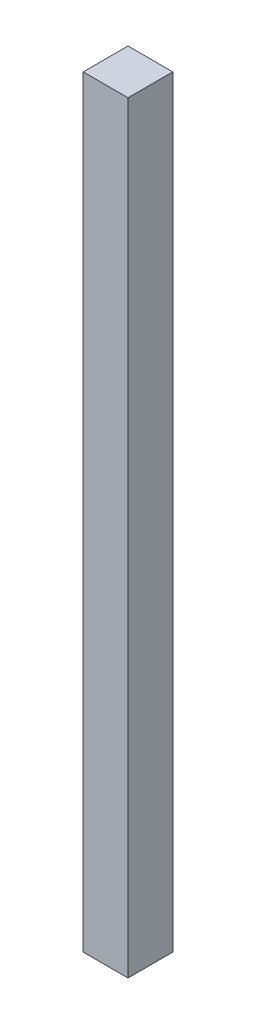
ISO-10303-21;
HEADER;
FILE_DESCRIPTION(('STEP AP214'),'2;1');
FILE_NAME('part.step','',(''),(''),'','','');
FILE_SCHEMA(('AUTOMOTIVE_DESIGN { 1 0 10303 214 1 1 1 1 }'));
ENDSEC;
DATA;
#1=APPLICATION_CONTEXT('core data for automotive mechanical design processes');
#2=APPLICATION_PROTOCOL_DEFINITION('international standard','automotive_design',2000,#1);
#3=PRODUCT_CONTEXT('',#1,'mechanical');
#4=PRODUCT('Part','Part','',(#3));
#5=PRODUCT_RELATED_PRODUCT_CATEGORY('part','',(#4));
#6=PRODUCT_DEFINITION_FORMATION('','',#4);
#7=PRODUCT_DEFINITION_CONTEXT('part definition',#1,'design');
#8=PRODUCT_DEFINITION('design','',#6,#7);
#9=PRODUCT_DEFINITION_SHAPE('','',#8);
#10=(LENGTH_UNIT() NAMED_UNIT(*) SI_UNIT(.MILLI.,.METRE.));
#11=(NAMED_UNIT(*) PLANE_ANGLE_UNIT() SI_UNIT($,.RADIAN.));
#12=(NAMED_UNIT(*) SI_UNIT($,.STERADIAN.) SOLID_ANGLE_UNIT());
#13=UNCERTAINTY_MEASURE_WITH_UNIT(LENGTH_MEASURE(1.E-05),#10,'distance_accuracy_value','');
#14=(GEOMETRIC_REPRESENTATION_CONTEXT(3) GLOBAL_UNCERTAINTY_ASSIGNED_CONTEXT((#13)) GLOBAL_UNIT_ASSIGNED_CONTEXT((#10,
#11,#12)) REPRESENTATION_CONTEXT('',''));
#15=CARTESIAN_POINT('',(0.,0.,0.));
#16=DIRECTION('',(0.,0.,1.));
#17=DIRECTION('',(1.,0.,0.));
#18=AXIS2_PLACEMENT_3D('',#15,#16,#17);
#19=CARTESIAN_POINT('',(0.,431.8,0.));
#20=DIRECTION('',(1.,0.,0.));
#21=DIRECTION('',(0.,0.,-1.));
#22=AXIS2_PLACEMENT_3D('',#19,#20,#21);
#23=PLANE('',#22);
#24=DIRECTION('',(0.,0.,1.));
#25=VECTOR('',#24,1.);
#26=CARTESIAN_POINT('',(0.,0.,0.));
#27=LINE('',#26,#25);
#28=CARTESIAN_POINT('',(0.,0.,-25.4));
#29=VERTEX_POINT('',#28);
#30=CARTESIAN_POINT('',(0.,0.,0.));
#31=VERTEX_POINT('',#30);
#32=EDGE_CURVE('E113',#29,#31,#27,.T.);
#33=ORIENTED_EDGE('',*,*,#32,.T.);
#34=DIRECTION('',(0.,-1.,0.));
#35=VECTOR('',#34,1.);
#36=CARTESIAN_POINT('',(0.,431.8,0.));
#37=LINE('',#36,#35);
#38=CARTESIAN_POINT('',(0.,431.8,0.));
#39=VERTEX_POINT('',#38);
#40=EDGE_CURVE('E11',#39,#31,#37,.T.);
#41=ORIENTED_EDGE('',*,*,#40,.F.);
#42=DIRECTION('',(0.,0.,1.));
#43=VECTOR('',#42,1.);
#44=CARTESIAN_POINT('',(0.,431.8,0.));
#45=LINE('',#44,#43);
#46=CARTESIAN_POINT('',(0.,431.8,-25.4));
#47=VERTEX_POINT('',#46);
#48=EDGE_CURVE('E97',#47,#39,#45,.T.);
#49=ORIENTED_EDGE('',*,*,#48,.F.);
#50=DIRECTION('',(0.,-1.,0.));
#51=VECTOR('',#50,1.);
#52=CARTESIAN_POINT('',(0.,431.8,-25.4));
#53=LINE('',#52,#51);
#54=EDGE_CURVE('E109',#47,#29,#53,.T.);
#55=ORIENTED_EDGE('',*,*,#54,.T.);
#56=EDGE_LOOP('',(#33,#41,#49,#55));
#57=FACE_BOUND('',#56,.T.);
#58=ADVANCED_FACE('F45',(#57),#23,.F.);
#59=CARTESIAN_POINT('',(0.,431.8,0.));
#60=DIRECTION('',(0.,0.,-1.));
#61=DIRECTION('',(-1.,0.,0.));
#62=AXIS2_PLACEMENT_3D('',#59,#60,#61);
#63=PLANE('',#62);
#64=DIRECTION('',(1.,0.,0.));
#65=VECTOR('',#64,1.);
#66=CARTESIAN_POINT('',(0.,0.,0.));
#67=LINE('',#66,#65);
#68=CARTESIAN_POINT('',(25.4,0.,0.));
#69=VERTEX_POINT('',#68);
#70=EDGE_CURVE('E102',#31,#69,#67,.T.);
#71=ORIENTED_EDGE('',*,*,#70,.T.);
#72=DIRECTION('',(0.,-1.,0.));
#73=VECTOR('',#72,1.);
#74=CARTESIAN_POINT('',(25.4,431.8,0.));
#75=LINE('',#74,#73);
#76=CARTESIAN_POINT('',(25.4,431.8,0.));
#77=VERTEX_POINT('',#76);
#78=EDGE_CURVE('E54',#77,#69,#75,.T.);
#79=ORIENTED_EDGE('',*,*,#78,.F.);
#80=DIRECTION('',(1.,0.,0.));
#81=VECTOR('',#80,1.);
#82=CARTESIAN_POINT('',(0.,431.8,0.));
#83=LINE('',#82,#81);
#84=EDGE_CURVE('E92',#39,#77,#83,.T.);
#85=ORIENTED_EDGE('',*,*,#84,.F.);
#86=ORIENTED_EDGE('',*,*,#40,.T.);
#87=EDGE_LOOP('',(#71,#79,#85,#86));
#88=FACE_BOUND('',#87,.T.);
#89=ADVANCED_FACE('F101',(#88),#63,.F.);
#90=CARTESIAN_POINT('',(25.4,431.8,0.));
#91=DIRECTION('',(-1.,0.,0.));
#92=DIRECTION('',(0.,0.,1.));
#93=AXIS2_PLACEMENT_3D('',#90,#91,#92);
#94=PLANE('',#93);
#95=DIRECTION('',(0.,0.,-1.));
#96=VECTOR('',#95,1.);
#97=CARTESIAN_POINT('',(25.4,0.,0.));
#98=LINE('',#97,#96);
#99=CARTESIAN_POINT('',(25.4,0.,-25.4));
#100=VERTEX_POINT('',#99);
#101=EDGE_CURVE('E79',#69,#100,#98,.T.);
#102=ORIENTED_EDGE('',*,*,#101,.T.);
#103=DIRECTION('',(0.,-1.,0.));
#104=VECTOR('',#103,1.);
#105=CARTESIAN_POINT('',(25.4,431.8,-25.4));
#106=LINE('',#105,#104);
#107=CARTESIAN_POINT('',(25.4,431.8,-25.4));
#108=VERTEX_POINT('',#107);
#109=EDGE_CURVE('E104',#108,#100,#106,.T.);
#110=ORIENTED_EDGE('',*,*,#109,.F.);
#111=DIRECTION('',(0.,0.,-1.));
#112=VECTOR('',#111,1.);
#113=CARTESIAN_POINT('',(25.4,431.8,0.));
#114=LINE('',#113,#112);
#115=EDGE_CURVE('E95',#77,#108,#114,.T.);
#116=ORIENTED_EDGE('',*,*,#115,.F.);
#117=ORIENTED_EDGE('',*,*,#78,.T.);
#118=EDGE_LOOP('',(#102,#110,#116,#117));
#119=FACE_BOUND('',#118,.T.);
#120=ADVANCED_FACE('F105',(#119),#94,.F.);
#121=CARTESIAN_POINT('',(0.,431.8,-25.4));
#122=DIRECTION('',(0.,0.,1.));
#123=DIRECTION('',(1.,0.,0.));
#124=AXIS2_PLACEMENT_3D('',#121,#122,#123);
#125=PLANE('',#124);
#126=DIRECTION('',(-1.,0.,0.));
#127=VECTOR('',#126,1.);
#128=CARTESIAN_POINT('',(0.,0.,-25.4));
#129=LINE('',#128,#127);
#130=EDGE_CURVE('E85',#100,#29,#129,.T.);
#131=ORIENTED_EDGE('',*,*,#130,.T.);
#132=ORIENTED_EDGE('',*,*,#54,.F.);
#133=DIRECTION('',(-1.,0.,0.));
#134=VECTOR('',#133,1.);
#135=CARTESIAN_POINT('',(0.,431.8,-25.4));
#136=LINE('',#135,#134);
#137=EDGE_CURVE('E62',#108,#47,#136,.T.);
#138=ORIENTED_EDGE('',*,*,#137,.F.);
#139=ORIENTED_EDGE('',*,*,#109,.T.);
#140=EDGE_LOOP('',(#131,#132,#138,#139));
#141=FACE_BOUND('',#140,.T.);
#142=ADVANCED_FACE('F126',(#141),#125,.F.);
#143=CARTESIAN_POINT('',(0.,431.8,0.));
#144=DIRECTION('',(0.,-1.,0.));
#145=DIRECTION('',(0.,0.,-1.));
#146=AXIS2_PLACEMENT_3D('',#143,#144,#145);
#147=PLANE('',#146);
#148=ORIENTED_EDGE('',*,*,#48,.T.);
#149=ORIENTED_EDGE('',*,*,#84,.T.);
#150=ORIENTED_EDGE('',*,*,#115,.T.);
#151=ORIENTED_EDGE('',*,*,#137,.T.);
#152=EDGE_LOOP('',(#148,#149,#150,#151));
#153=FACE_BOUND('',#152,.T.);
#154=ADVANCED_FACE('F93',(#153),#147,.F.);
#155=CARTESIAN_POINT('',(0.,0.,0.));
#156=DIRECTION('',(0.,-1.,0.));
#157=DIRECTION('',(0.,0.,-1.));
#158=AXIS2_PLACEMENT_3D('',#155,#156,#157);
#159=PLANE('',#158);
#160=ORIENTED_EDGE('',*,*,#32,.F.);
#161=ORIENTED_EDGE('',*,*,#130,.F.);
#162=ORIENTED_EDGE('',*,*,#101,.F.);
#163=ORIENTED_EDGE('',*,*,#70,.F.);
#164=EDGE_LOOP('',(#160,#161,#162,#163));
#165=FACE_BOUND('',#164,.T.);
#166=ADVANCED_FACE('F129',(#165),#159,.T.);
#167=CLOSED_SHELL('',(#58,#89,#120,#142,#154,#166));
#168=MANIFOLD_SOLID_BREP('B2',#167);
#169=ADVANCED_BREP_SHAPE_REPRESENTATION('',(#18,#168),#14);
#170=SHAPE_DEFINITION_REPRESENTATION(#9,#169);
ENDSEC;
END-ISO-10303-21;
